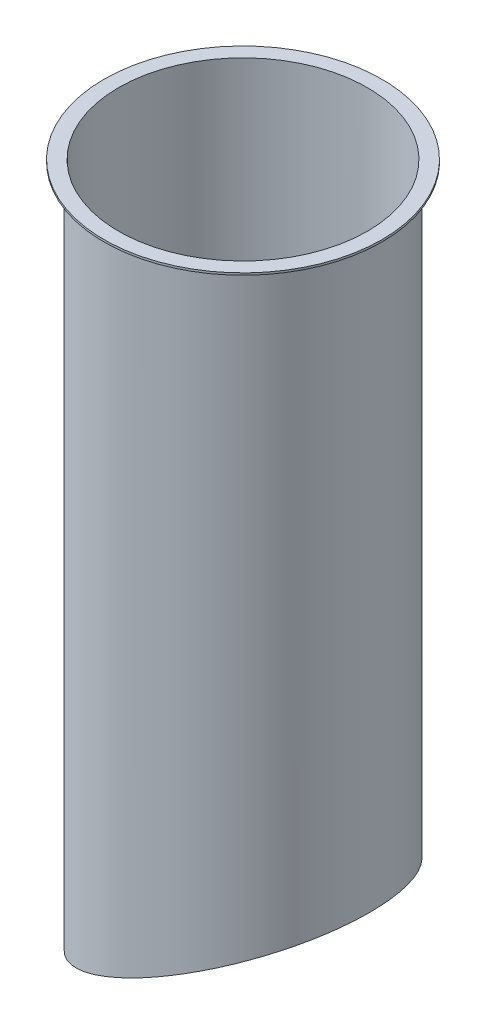
ISO-10303-21;
HEADER;
FILE_DESCRIPTION(('STEP AP214'),'2;1');
FILE_NAME('part.step','',(''),(''),'','','');
FILE_SCHEMA(('AUTOMOTIVE_DESIGN { 1 0 10303 214 1 1 1 1 }'));
ENDSEC;
DATA;
#1=APPLICATION_CONTEXT('core data for automotive mechanical design processes');
#2=APPLICATION_PROTOCOL_DEFINITION('international standard','automotive_design',2000,#1);
#3=PRODUCT_CONTEXT('',#1,'mechanical');
#4=PRODUCT('Part','Part','',(#3));
#5=PRODUCT_RELATED_PRODUCT_CATEGORY('part','',(#4));
#6=PRODUCT_DEFINITION_FORMATION('','',#4);
#7=PRODUCT_DEFINITION_CONTEXT('part definition',#1,'design');
#8=PRODUCT_DEFINITION('design','',#6,#7);
#9=PRODUCT_DEFINITION_SHAPE('','',#8);
#10=(LENGTH_UNIT() NAMED_UNIT(*) SI_UNIT(.MILLI.,.METRE.));
#11=(NAMED_UNIT(*) PLANE_ANGLE_UNIT() SI_UNIT($,.RADIAN.));
#12=(NAMED_UNIT(*) SI_UNIT($,.STERADIAN.) SOLID_ANGLE_UNIT());
#13=UNCERTAINTY_MEASURE_WITH_UNIT(LENGTH_MEASURE(1.E-05),#10,'distance_accuracy_value','');
#14=(GEOMETRIC_REPRESENTATION_CONTEXT(3) GLOBAL_UNCERTAINTY_ASSIGNED_CONTEXT((#13)) GLOBAL_UNIT_ASSIGNED_CONTEXT((#10,
#11,#12)) REPRESENTATION_CONTEXT('',''));
#15=CARTESIAN_POINT('',(0.,0.,0.));
#16=DIRECTION('',(0.,0.,1.));
#17=DIRECTION('',(1.,0.,0.));
#18=AXIS2_PLACEMENT_3D('',#15,#16,#17);
#19=CARTESIAN_POINT('',(-63.5,984.,0.));
#20=DIRECTION('',(0.,1.,0.));
#21=DIRECTION('',(1.,0.,0.));
#22=AXIS2_PLACEMENT_3D('',#19,#20,#21);
#23=PLANE('',#22);
#24=CARTESIAN_POINT('',(0.,984.,0.));
#25=DIRECTION('',(0.,1.,0.));
#26=DIRECTION('',(-1.,0.,0.));
#27=AXIS2_PLACEMENT_3D('',#24,#25,#26);
#28=CIRCLE('',#27,60.);
#29=CARTESIAN_POINT('',(-60.,984.,0.));
#30=VERTEX_POINT('',#29);
#31=EDGE_CURVE('E69',#30,#30,#28,.T.);
#32=ORIENTED_EDGE('',*,*,#31,.F.);
#33=EDGE_LOOP('',(#32));
#34=FACE_BOUND('',#33,.T.);
#35=CARTESIAN_POINT('',(0.,984.,0.));
#36=DIRECTION('',(0.,1.,0.));
#37=DIRECTION('',(-1.,0.,0.));
#38=AXIS2_PLACEMENT_3D('',#35,#36,#37);
#39=CIRCLE('',#38,67.);
#40=CARTESIAN_POINT('',(-67.,984.,0.));
#41=VERTEX_POINT('',#40);
#42=EDGE_CURVE('E11',#41,#41,#39,.T.);
#43=ORIENTED_EDGE('',*,*,#42,.T.);
#44=EDGE_LOOP('',(#43));
#45=FACE_BOUND('',#44,.T.);
#46=ADVANCED_FACE('F41',(#34,#45),#23,.T.);
#47=CARTESIAN_POINT('',(0.,983.5,0.));
#48=DIRECTION('',(0.,1.,0.));
#49=DIRECTION('',(-1.,0.,0.));
#50=AXIS2_PLACEMENT_3D('',#47,#48,#49);
#51=CYLINDRICAL_SURFACE('',#50,67.);
#52=CARTESIAN_POINT('',(0.,983.,0.));
#53=DIRECTION('',(0.,1.,0.));
#54=DIRECTION('',(-1.,0.,0.));
#55=AXIS2_PLACEMENT_3D('',#52,#53,#54);
#56=CIRCLE('',#55,67.);
#57=CARTESIAN_POINT('',(-67.,983.,0.));
#58=VERTEX_POINT('',#57);
#59=EDGE_CURVE('E51',#58,#58,#56,.T.);
#60=ORIENTED_EDGE('',*,*,#59,.T.);
#61=EDGE_LOOP('',(#60));
#62=FACE_BOUND('',#61,.T.);
#63=ORIENTED_EDGE('',*,*,#42,.F.);
#64=EDGE_LOOP('',(#63));
#65=FACE_BOUND('',#64,.T.);
#66=ADVANCED_FACE('F105',(#62,#65),#51,.T.);
#67=CARTESIAN_POINT('',(-64.,983.,0.));
#68=DIRECTION('',(0.,-1.,0.));
#69=DIRECTION('',(0.,0.,-1.));
#70=AXIS2_PLACEMENT_3D('',#67,#68,#69);
#71=PLANE('',#70);
#72=CARTESIAN_POINT('',(0.,983.,0.));
#73=DIRECTION('',(0.,1.,0.));
#74=DIRECTION('',(-1.,0.,0.));
#75=AXIS2_PLACEMENT_3D('',#72,#73,#74);
#76=CIRCLE('',#75,61.);
#77=CARTESIAN_POINT('',(-61.,983.,0.));
#78=VERTEX_POINT('',#77);
#79=EDGE_CURVE('E75',#78,#78,#76,.T.);
#80=ORIENTED_EDGE('',*,*,#79,.T.);
#81=EDGE_LOOP('',(#80));
#82=FACE_BOUND('',#81,.T.);
#83=ORIENTED_EDGE('',*,*,#59,.F.);
#84=EDGE_LOOP('',(#83));
#85=FACE_BOUND('',#84,.T.);
#86=ADVANCED_FACE('F76',(#82,#85),#71,.T.);
#87=CARTESIAN_POINT('',(0.,492.,0.));
#88=DIRECTION('',(0.,1.,0.));
#89=DIRECTION('',(-1.,0.,0.));
#90=AXIS2_PLACEMENT_3D('',#87,#88,#89);
#91=CYLINDRICAL_SURFACE('',#90,61.);
#92=CARTESIAN_POINT('',(0.,672.883568708276,0.));
#93=DIRECTION('',(-0.406491752825079,0.913654450481797,0.));
#94=DIRECTION('',(0.913654450481797,0.406491752825079,0.));
#95=AXIS2_PLACEMENT_3D('',#92,#93,#94);
#96=ELLIPSE('',#95,66.7648474407725,61.);
#97=CARTESIAN_POINT('',(61.,700.022928571575,0.));
#98=VERTEX_POINT('',#97);
#99=EDGE_CURVE('E85',#98,#98,#96,.F.);
#100=ORIENTED_EDGE('',*,*,#99,.F.);
#101=EDGE_LOOP('',(#100));
#102=FACE_BOUND('',#101,.T.);
#103=ORIENTED_EDGE('',*,*,#79,.F.);
#104=EDGE_LOOP('',(#103));
#105=FACE_BOUND('',#104,.T.);
#106=ADVANCED_FACE('F102',(#102,#105),#91,.T.);
#107=CARTESIAN_POINT('',(0.,492.,0.));
#108=DIRECTION('',(0.,1.,0.));
#109=DIRECTION('',(-1.,0.,0.));
#110=AXIS2_PLACEMENT_3D('',#107,#108,#109);
#111=CYLINDRICAL_SURFACE('',#110,60.);
#112=CARTESIAN_POINT('',(0.,672.883568708276,0.));
#113=DIRECTION('',(-0.406491752825079,0.913654450481797,0.));
#114=DIRECTION('',(0.913654450481797,0.406491752825079,0.));
#115=AXIS2_PLACEMENT_3D('',#112,#113,#114);
#116=ELLIPSE('',#115,65.6703417450221,60.);
#117=CARTESIAN_POINT('',(60.,699.578021032832,0.));
#118=VERTEX_POINT('',#117);
#119=EDGE_CURVE('E44',#118,#118,#116,.F.);
#120=ORIENTED_EDGE('',*,*,#119,.T.);
#121=EDGE_LOOP('',(#120));
#122=FACE_BOUND('',#121,.T.);
#123=ORIENTED_EDGE('',*,*,#31,.T.);
#124=EDGE_LOOP('',(#123));
#125=FACE_BOUND('',#124,.T.);
#126=ADVANCED_FACE('F94',(#122,#125),#111,.F.);
#127=CARTESIAN_POINT('',(-156.412835639356,603.29431897622,-67.));
#128=DIRECTION('',(-0.406491752825079,0.913654450481797,0.));
#129=DIRECTION('',(-0.913654450481797,-0.406491752825079,0.));
#130=AXIS2_PLACEMENT_3D('',#127,#128,#129);
#131=PLANE('',#130);
#132=ORIENTED_EDGE('',*,*,#99,.T.);
#133=EDGE_LOOP('',(#132));
#134=FACE_BOUND('',#133,.T.);
#135=ORIENTED_EDGE('',*,*,#119,.F.);
#136=EDGE_LOOP('',(#135));
#137=FACE_BOUND('',#136,.T.);
#138=ADVANCED_FACE('F96',(#134,#137),#131,.F.);
#139=CLOSED_SHELL('',(#46,#66,#86,#106,#126,#138));
#140=MANIFOLD_SOLID_BREP('B2',#139);
#141=ADVANCED_BREP_SHAPE_REPRESENTATION('',(#18,#140),#14);
#142=SHAPE_DEFINITION_REPRESENTATION(#9,#141);
ENDSEC;
END-ISO-10303-21;
